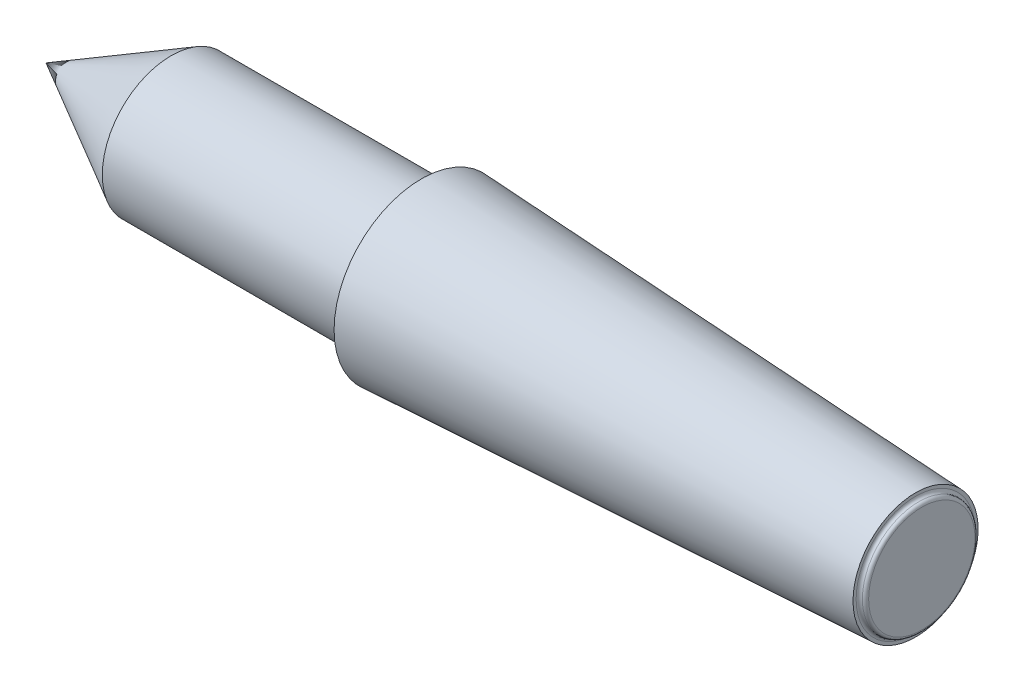
ISO-10303-21;
HEADER;
FILE_DESCRIPTION(('STEP AP214'),'2;1');
FILE_NAME('part.step','',(''),(''),'','','');
FILE_SCHEMA(('AUTOMOTIVE_DESIGN { 1 0 10303 214 1 1 1 1 }'));
ENDSEC;
DATA;
#1=APPLICATION_CONTEXT('core data for automotive mechanical design processes');
#2=APPLICATION_PROTOCOL_DEFINITION('international standard','automotive_design',2000,#1);
#3=PRODUCT_CONTEXT('',#1,'mechanical');
#4=PRODUCT('Part','Part','',(#3));
#5=PRODUCT_RELATED_PRODUCT_CATEGORY('part','',(#4));
#6=PRODUCT_DEFINITION_FORMATION('','',#4);
#7=PRODUCT_DEFINITION_CONTEXT('part definition',#1,'design');
#8=PRODUCT_DEFINITION('design','',#6,#7);
#9=PRODUCT_DEFINITION_SHAPE('','',#8);
#10=(LENGTH_UNIT() NAMED_UNIT(*) SI_UNIT(.MILLI.,.METRE.));
#11=(NAMED_UNIT(*) PLANE_ANGLE_UNIT() SI_UNIT($,.RADIAN.));
#12=(NAMED_UNIT(*) SI_UNIT($,.STERADIAN.) SOLID_ANGLE_UNIT());
#13=UNCERTAINTY_MEASURE_WITH_UNIT(LENGTH_MEASURE(1.E-05),#10,'distance_accuracy_value','');
#14=(GEOMETRIC_REPRESENTATION_CONTEXT(3) GLOBAL_UNCERTAINTY_ASSIGNED_CONTEXT((#13)) GLOBAL_UNIT_ASSIGNED_CONTEXT((#10,
#11,#12)) REPRESENTATION_CONTEXT('',''));
#15=CARTESIAN_POINT('',(0.,0.,0.));
#16=DIRECTION('',(0.,0.,1.));
#17=DIRECTION('',(1.,0.,0.));
#18=AXIS2_PLACEMENT_3D('',#15,#16,#17);
#19=CARTESIAN_POINT('',(-120.,0.,0.));
#20=DIRECTION('',(1.,0.,0.));
#21=DIRECTION('',(0.,0.,-1.));
#22=AXIS2_PLACEMENT_3D('',#19,#20,#21);
#23=CONICAL_SURFACE('',#22,11.,0.50284321092786);
#24=CARTESIAN_POINT('',(-140.,0.,0.));
#25=VERTEX_POINT('',#24);
#26=VERTEX_LOOP('',#25);
#27=FACE_BOUND('',#26,.T.);
#28=CARTESIAN_POINT('',(-120.,0.,0.));
#29=DIRECTION('',(-1.,0.,0.));
#30=DIRECTION('',(0.,0.,1.));
#31=AXIS2_PLACEMENT_3D('',#28,#29,#30);
#32=CIRCLE('',#31,11.);
#33=CARTESIAN_POINT('',(-120.,0.,11.));
#34=VERTEX_POINT('',#33);
#35=EDGE_CURVE('E63',#34,#34,#32,.T.);
#36=ORIENTED_EDGE('',*,*,#35,.T.);
#37=EDGE_LOOP('',(#36));
#38=FACE_BOUND('',#37,.T.);
#39=ADVANCED_FACE('F45',(#27,#38),#23,.T.);
#40=CARTESIAN_POINT('',(-857.45078552779,0.,0.));
#41=DIRECTION('',(-1.,0.,0.));
#42=DIRECTION('',(0.,0.,1.));
#43=AXIS2_PLACEMENT_3D('',#40,#41,#42);
#44=CYLINDRICAL_SURFACE('',#43,11.);
#45=CARTESIAN_POINT('',(-80.5,0.,0.));
#46=DIRECTION('',(1.,0.,0.));
#47=DIRECTION('',(0.,0.,-1.));
#48=AXIS2_PLACEMENT_3D('',#45,#46,#47);
#49=CIRCLE('',#48,11.);
#50=CARTESIAN_POINT('',(-80.5,0.,-11.));
#51=VERTEX_POINT('',#50);
#52=EDGE_CURVE('E54',#51,#51,#49,.F.);
#53=ORIENTED_EDGE('',*,*,#52,.T.);
#54=EDGE_LOOP('',(#53));
#55=FACE_BOUND('',#54,.T.);
#56=ORIENTED_EDGE('',*,*,#35,.F.);
#57=EDGE_LOOP('',(#56));
#58=FACE_BOUND('',#57,.T.);
#59=ADVANCED_FACE('F59',(#55,#58),#44,.T.);
#60=CARTESIAN_POINT('',(-80.,0.,-11.));
#61=DIRECTION('',(1.,0.,0.));
#62=DIRECTION('',(0.,0.,-1.));
#63=AXIS2_PLACEMENT_3D('',#60,#61,#62);
#64=PLANE('',#63);
#65=CARTESIAN_POINT('',(-80.,0.,0.));
#66=DIRECTION('',(1.,0.,0.));
#67=DIRECTION('',(0.,0.,-1.));
#68=AXIS2_PLACEMENT_3D('',#65,#66,#67);
#69=CIRCLE('',#68,11.5);
#70=CARTESIAN_POINT('',(-80.,0.,-11.5));
#71=VERTEX_POINT('',#70);
#72=EDGE_CURVE('E11',#71,#71,#69,.T.);
#73=ORIENTED_EDGE('',*,*,#72,.T.);
#74=EDGE_LOOP('',(#73));
#75=FACE_BOUND('',#74,.T.);
#76=CARTESIAN_POINT('',(-80.0000000000001,0.,0.));
#77=DIRECTION('',(-1.,0.,0.));
#78=DIRECTION('',(0.,0.,1.));
#79=AXIS2_PLACEMENT_3D('',#76,#77,#78);
#80=CIRCLE('',#79,13.95);
#81=CARTESIAN_POINT('',(-80.0000000000001,0.,13.95));
#82=VERTEX_POINT('',#81);
#83=EDGE_CURVE('E67',#82,#82,#80,.T.);
#84=ORIENTED_EDGE('',*,*,#83,.T.);
#85=EDGE_LOOP('',(#84));
#86=FACE_BOUND('',#85,.T.);
#87=ADVANCED_FACE('F98',(#75,#86),#64,.F.);
#88=CARTESIAN_POINT('',(-1.,0.,0.));
#89=DIRECTION('',(-1.,0.,0.));
#90=DIRECTION('',(0.,0.,1.));
#91=AXIS2_PLACEMENT_3D('',#88,#89,#90);
#92=CONICAL_SURFACE('',#91,10.,0.0499583957219428);
#93=ORIENTED_EDGE('',*,*,#83,.F.);
#94=EDGE_LOOP('',(#93));
#95=FACE_BOUND('',#94,.T.);
#96=CARTESIAN_POINT('',(-1.,0.,0.));
#97=DIRECTION('',(-1.,0.,0.));
#98=DIRECTION('',(0.,0.,1.));
#99=AXIS2_PLACEMENT_3D('',#96,#97,#98);
#100=CIRCLE('',#99,10.);
#101=CARTESIAN_POINT('',(-1.,0.,10.));
#102=VERTEX_POINT('',#101);
#103=EDGE_CURVE('E75',#102,#102,#100,.T.);
#104=ORIENTED_EDGE('',*,*,#103,.T.);
#105=EDGE_LOOP('',(#104));
#106=FACE_BOUND('',#105,.T.);
#107=ADVANCED_FACE('F101',(#95,#106),#92,.T.);
#108=CARTESIAN_POINT('',(-1.00000000000001,0.,-10.));
#109=DIRECTION('',(-1.,0.,0.));
#110=DIRECTION('',(0.,0.,1.));
#111=AXIS2_PLACEMENT_3D('',#108,#109,#110);
#112=PLANE('',#111);
#113=CARTESIAN_POINT('',(-1.00000000000001,0.,0.));
#114=DIRECTION('',(-1.,0.,0.));
#115=DIRECTION('',(0.,0.,1.));
#116=AXIS2_PLACEMENT_3D('',#113,#114,#115);
#117=CIRCLE('',#116,9.5);
#118=CARTESIAN_POINT('',(-1.00000000000001,0.,9.5));
#119=VERTEX_POINT('',#118);
#120=EDGE_CURVE('E72',#119,#119,#117,.T.);
#121=ORIENTED_EDGE('',*,*,#120,.T.);
#122=EDGE_LOOP('',(#121));
#123=FACE_BOUND('',#122,.T.);
#124=ORIENTED_EDGE('',*,*,#103,.F.);
#125=EDGE_LOOP('',(#124));
#126=FACE_BOUND('',#125,.T.);
#127=ADVANCED_FACE('F107',(#123,#126),#112,.F.);
#128=CARTESIAN_POINT('',(0.,0.,-9.));
#129=DIRECTION('',(-1.,0.,0.));
#130=DIRECTION('',(0.,0.,1.));
#131=AXIS2_PLACEMENT_3D('',#128,#129,#130);
#132=PLANE('',#131);
#133=CARTESIAN_POINT('',(0.,0.,0.));
#134=DIRECTION('',(-1.,0.,0.));
#135=DIRECTION('',(0.,0.,1.));
#136=AXIS2_PLACEMENT_3D('',#133,#134,#135);
#137=CIRCLE('',#136,8.5);
#138=CARTESIAN_POINT('',(0.,0.,8.5));
#139=VERTEX_POINT('',#138);
#140=EDGE_CURVE('E66',#139,#139,#137,.F.);
#141=ORIENTED_EDGE('',*,*,#140,.T.);
#142=EDGE_LOOP('',(#141));
#143=FACE_BOUND('',#142,.T.);
#144=ADVANCED_FACE('F119',(#143),#132,.F.);
#145=CARTESIAN_POINT('',(-0.500000000000056,0.,0.));
#146=DIRECTION('',(-1.,0.,0.));
#147=DIRECTION('',(0.,0.,1.));
#148=AXIS2_PLACEMENT_3D('',#145,#146,#147);
#149=TOROIDAL_SURFACE('',#148,9.5,0.5);
#150=ORIENTED_EDGE('',*,*,#120,.F.);
#151=EDGE_LOOP('',(#150));
#152=FACE_BOUND('',#151,.T.);
#153=CARTESIAN_POINT('',(-0.500000000000056,0.,0.));
#154=DIRECTION('',(-1.,0.,0.));
#155=DIRECTION('',(0.,0.,1.));
#156=AXIS2_PLACEMENT_3D('',#153,#154,#155);
#157=CIRCLE('',#156,9.);
#158=CARTESIAN_POINT('',(-0.500000000000056,0.,9.));
#159=VERTEX_POINT('',#158);
#160=EDGE_CURVE('E49',#159,#159,#157,.F.);
#161=ORIENTED_EDGE('',*,*,#160,.F.);
#162=EDGE_LOOP('',(#161));
#163=FACE_BOUND('',#162,.T.);
#164=ADVANCED_FACE('F93',(#152,#163),#149,.F.);
#165=CARTESIAN_POINT('',(-0.499999999999945,0.,0.));
#166=DIRECTION('',(-1.,0.,0.));
#167=DIRECTION('',(0.,0.,1.));
#168=AXIS2_PLACEMENT_3D('',#165,#166,#167);
#169=TOROIDAL_SURFACE('',#168,8.5,0.5);
#170=ORIENTED_EDGE('',*,*,#140,.F.);
#171=EDGE_LOOP('',(#170));
#172=FACE_BOUND('',#171,.T.);
#173=ORIENTED_EDGE('',*,*,#160,.T.);
#174=EDGE_LOOP('',(#173));
#175=FACE_BOUND('',#174,.T.);
#176=ADVANCED_FACE('F88',(#172,#175),#169,.T.);
#177=CARTESIAN_POINT('',(-80.5,0.,0.));
#178=DIRECTION('',(1.,0.,0.));
#179=DIRECTION('',(0.,0.,-1.));
#180=AXIS2_PLACEMENT_3D('',#177,#178,#179);
#181=TOROIDAL_SURFACE('',#180,11.5,0.5);
#182=ORIENTED_EDGE('',*,*,#72,.F.);
#183=EDGE_LOOP('',(#182));
#184=FACE_BOUND('',#183,.T.);
#185=ORIENTED_EDGE('',*,*,#52,.F.);
#186=EDGE_LOOP('',(#185));
#187=FACE_BOUND('',#186,.T.);
#188=ADVANCED_FACE('F47',(#184,#187),#181,.F.);
#189=CLOSED_SHELL('',(#39,#59,#87,#107,#127,#144,#164,#176,#188));
#190=MANIFOLD_SOLID_BREP('B2',#189);
#191=ADVANCED_BREP_SHAPE_REPRESENTATION('',(#18,#190),#14);
#192=SHAPE_DEFINITION_REPRESENTATION(#9,#191);
ENDSEC;
END-ISO-10303-21;
